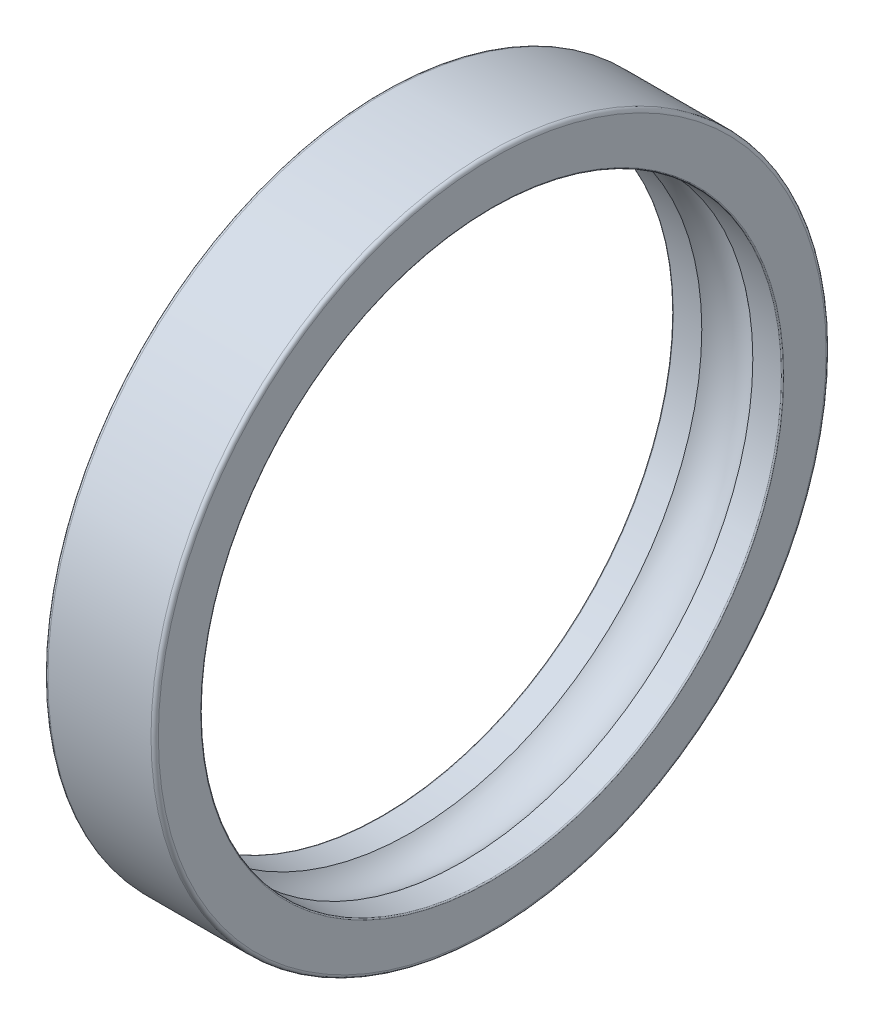
ISO-10303-21;
HEADER;
FILE_DESCRIPTION(('STEP AP214'),'2;1');
FILE_NAME('part.step','',(''),(''),'','','');
FILE_SCHEMA(('AUTOMOTIVE_DESIGN { 1 0 10303 214 1 1 1 1 }'));
ENDSEC;
DATA;
#1=APPLICATION_CONTEXT('core data for automotive mechanical design processes');
#2=APPLICATION_PROTOCOL_DEFINITION('international standard','automotive_design',2000,#1);
#3=PRODUCT_CONTEXT('',#1,'mechanical');
#4=PRODUCT('Part','Part','',(#3));
#5=PRODUCT_RELATED_PRODUCT_CATEGORY('part','',(#4));
#6=PRODUCT_DEFINITION_FORMATION('','',#4);
#7=PRODUCT_DEFINITION_CONTEXT('part definition',#1,'design');
#8=PRODUCT_DEFINITION('design','',#6,#7);
#9=PRODUCT_DEFINITION_SHAPE('','',#8);
#10=(LENGTH_UNIT() NAMED_UNIT(*) SI_UNIT(.MILLI.,.METRE.));
#11=(NAMED_UNIT(*) PLANE_ANGLE_UNIT() SI_UNIT($,.RADIAN.));
#12=(NAMED_UNIT(*) SI_UNIT($,.STERADIAN.) SOLID_ANGLE_UNIT());
#13=UNCERTAINTY_MEASURE_WITH_UNIT(LENGTH_MEASURE(1.E-05),#10,'distance_accuracy_value','');
#14=(GEOMETRIC_REPRESENTATION_CONTEXT(3) GLOBAL_UNCERTAINTY_ASSIGNED_CONTEXT((#13)) GLOBAL_UNIT_ASSIGNED_CONTEXT((#10,
#11,#12)) REPRESENTATION_CONTEXT('',''));
#15=CARTESIAN_POINT('',(0.,0.,0.));
#16=DIRECTION('',(0.,0.,1.));
#17=DIRECTION('',(1.,0.,0.));
#18=AXIS2_PLACEMENT_3D('',#15,#16,#17);
#19=CARTESIAN_POINT('',(0.,-27.7052765498038,-27.2));
#20=DIRECTION('',(-1.,0.,0.));
#21=DIRECTION('',(0.,0.,1.));
#22=AXIS2_PLACEMENT_3D('',#19,#20,#21);
#23=PLANE('',#22);
#24=CARTESIAN_POINT('',(0.,0.,0.));
#25=DIRECTION('',(-1.,0.,0.));
#26=DIRECTION('',(0.,0.,-1.));
#27=AXIS2_PLACEMENT_3D('',#24,#25,#26);
#28=CIRCLE('',#27,27.2);
#29=CARTESIAN_POINT('',(0.,0.,-27.2));
#30=VERTEX_POINT('',#29);
#31=EDGE_CURVE('E50',#30,#30,#28,.F.);
#32=ORIENTED_EDGE('',*,*,#31,.F.);
#33=EDGE_LOOP('',(#32));
#34=FACE_BOUND('',#33,.T.);
#35=CARTESIAN_POINT('',(0.,0.,0.));
#36=DIRECTION('',(1.,0.,0.));
#37=DIRECTION('',(0.,-1.16843726740818E-09,1.));
#38=AXIS2_PLACEMENT_3D('',#35,#36,#37);
#39=CIRCLE('',#38,23.7499999999994);
#40=CARTESIAN_POINT('',(0.,-2.77503851009435E-08,23.7499999999994));
#41=VERTEX_POINT('',#40);
#42=EDGE_CURVE('E47',#41,#41,#39,.T.);
#43=ORIENTED_EDGE('',*,*,#42,.T.);
#44=EDGE_LOOP('',(#43));
#45=FACE_BOUND('',#44,.T.);
#46=ADVANCED_FACE('F15',(#34,#45),#23,.T.);
#47=CARTESIAN_POINT('',(9.,-27.7052765498038,27.2));
#48=DIRECTION('',(1.,0.,0.));
#49=DIRECTION('',(0.,0.,-1.));
#50=AXIS2_PLACEMENT_3D('',#47,#48,#49);
#51=PLANE('',#50);
#52=CARTESIAN_POINT('',(9.,0.,0.));
#53=DIRECTION('',(1.,0.,0.));
#54=DIRECTION('',(0.,0.,1.));
#55=AXIS2_PLACEMENT_3D('',#52,#53,#54);
#56=CIRCLE('',#55,27.2000000077429);
#57=CARTESIAN_POINT('',(9.,0.,27.2000000077429));
#58=VERTEX_POINT('',#57);
#59=EDGE_CURVE('E44',#58,#58,#56,.T.);
#60=ORIENTED_EDGE('',*,*,#59,.T.);
#61=EDGE_LOOP('',(#60));
#62=FACE_BOUND('',#61,.T.);
#63=CARTESIAN_POINT('',(9.,0.,0.));
#64=DIRECTION('',(-1.,0.,0.));
#65=DIRECTION('',(0.,0.,-1.));
#66=AXIS2_PLACEMENT_3D('',#63,#64,#65);
#67=CIRCLE('',#66,23.7500000165255);
#68=CARTESIAN_POINT('',(9.,0.,-23.7500000165255));
#69=VERTEX_POINT('',#68);
#70=EDGE_CURVE('E41',#69,#69,#67,.F.);
#71=ORIENTED_EDGE('',*,*,#70,.F.);
#72=EDGE_LOOP('',(#71));
#73=FACE_BOUND('',#72,.T.);
#74=ADVANCED_FACE('F59',(#62,#73),#51,.T.);
#75=CARTESIAN_POINT('',(0.299999999999941,0.,0.));
#76=DIRECTION('',(1.,0.,0.));
#77=DIRECTION('',(0.,1.92339600142841E-10,1.));
#78=AXIS2_PLACEMENT_3D('',#75,#76,#77);
#79=TOROIDAL_SURFACE('',#78,27.2,0.299999999999939);
#80=ORIENTED_EDGE('',*,*,#31,.T.);
#81=EDGE_LOOP('',(#80));
#82=FACE_BOUND('',#81,.T.);
#83=CARTESIAN_POINT('',(0.299999999999941,0.,0.));
#84=DIRECTION('',(-1.,0.,0.));
#85=DIRECTION('',(0.,0.,-1.));
#86=AXIS2_PLACEMENT_3D('',#83,#84,#85);
#87=CIRCLE('',#86,27.4999999999999);
#88=CARTESIAN_POINT('',(0.299999999999941,0.,-27.4999999999999));
#89=VERTEX_POINT('',#88);
#90=EDGE_CURVE('E38',#89,#89,#87,.F.);
#91=ORIENTED_EDGE('',*,*,#90,.F.);
#92=EDGE_LOOP('',(#91));
#93=FACE_BOUND('',#92,.T.);
#94=ADVANCED_FACE('F54',(#82,#93),#79,.T.);
#95=CARTESIAN_POINT('',(0.0999999999994148,0.,0.));
#96=DIRECTION('',(1.,0.,0.));
#97=DIRECTION('',(0.,0.,1.));
#98=AXIS2_PLACEMENT_3D('',#95,#96,#97);
#99=TOROIDAL_SURFACE('',#98,23.7499999999994,0.0999999999994148);
#100=CARTESIAN_POINT('',(0.100000000000003,0.,0.));
#101=DIRECTION('',(1.,0.,0.));
#102=DIRECTION('',(0.,0.,1.));
#103=AXIS2_PLACEMENT_3D('',#100,#101,#102);
#104=CIRCLE('',#103,23.65);
#105=CARTESIAN_POINT('',(0.100000000000003,0.,23.65));
#106=VERTEX_POINT('',#105);
#107=EDGE_CURVE('E35',#106,#106,#104,.T.);
#108=ORIENTED_EDGE('',*,*,#107,.T.);
#109=EDGE_LOOP('',(#108));
#110=FACE_BOUND('',#109,.T.);
#111=ORIENTED_EDGE('',*,*,#42,.F.);
#112=EDGE_LOOP('',(#111));
#113=FACE_BOUND('',#112,.T.);
#114=ADVANCED_FACE('F63',(#110,#113),#99,.T.);
#115=CARTESIAN_POINT('',(50.,0.,0.));
#116=DIRECTION('',(1.,0.,0.));
#117=DIRECTION('',(0.,0.,1.));
#118=AXIS2_PLACEMENT_3D('',#115,#116,#117);
#119=CYLINDRICAL_SURFACE('',#118,23.65);
#120=CARTESIAN_POINT('',(2.42138868472239,0.,0.));
#121=DIRECTION('',(1.,0.,0.));
#122=DIRECTION('',(0.,0.,1.));
#123=AXIS2_PLACEMENT_3D('',#120,#121,#122);
#124=CIRCLE('',#123,23.65);
#125=CARTESIAN_POINT('',(2.42138868472239,0.,23.65));
#126=VERTEX_POINT('',#125);
#127=EDGE_CURVE('E30',#126,#126,#124,.T.);
#128=ORIENTED_EDGE('',*,*,#127,.T.);
#129=EDGE_LOOP('',(#128));
#130=FACE_BOUND('',#129,.T.);
#131=ORIENTED_EDGE('',*,*,#107,.F.);
#132=EDGE_LOOP('',(#131));
#133=FACE_BOUND('',#132,.T.);
#134=ADVANCED_FACE('F65',(#130,#133),#119,.F.);
#135=CARTESIAN_POINT('',(4.5,0.,0.));
#136=DIRECTION('',(1.,0.,0.));
#137=DIRECTION('',(0.,0.,1.));
#138=AXIS2_PLACEMENT_3D('',#135,#136,#137);
#139=TOROIDAL_SURFACE('',#138,21.25,3.17500000000003);
#140=ORIENTED_EDGE('',*,*,#127,.F.);
#141=EDGE_LOOP('',(#140));
#142=FACE_BOUND('',#141,.T.);
#143=CARTESIAN_POINT('',(6.57861131527761,0.,0.));
#144=DIRECTION('',(1.,0.,0.));
#145=DIRECTION('',(0.,0.,1.));
#146=AXIS2_PLACEMENT_3D('',#143,#144,#145);
#147=CIRCLE('',#146,23.65);
#148=CARTESIAN_POINT('',(6.57861131527761,0.,23.65));
#149=VERTEX_POINT('',#148);
#150=EDGE_CURVE('E26',#149,#149,#147,.T.);
#151=ORIENTED_EDGE('',*,*,#150,.T.);
#152=EDGE_LOOP('',(#151));
#153=FACE_BOUND('',#152,.T.);
#154=ADVANCED_FACE('F73',(#142,#153),#139,.F.);
#155=CARTESIAN_POINT('',(50.,0.,0.));
#156=DIRECTION('',(1.,0.,0.));
#157=DIRECTION('',(0.,0.,1.));
#158=AXIS2_PLACEMENT_3D('',#155,#156,#157);
#159=CYLINDRICAL_SURFACE('',#158,23.65);
#160=CARTESIAN_POINT('',(8.9,0.,0.));
#161=DIRECTION('',(1.,0.,0.));
#162=DIRECTION('',(0.,0.,1.));
#163=AXIS2_PLACEMENT_3D('',#160,#161,#162);
#164=CIRCLE('',#163,23.65);
#165=CARTESIAN_POINT('',(8.9,0.,23.65));
#166=VERTEX_POINT('',#165);
#167=EDGE_CURVE('E22',#166,#166,#164,.T.);
#168=ORIENTED_EDGE('',*,*,#167,.T.);
#169=EDGE_LOOP('',(#168));
#170=FACE_BOUND('',#169,.T.);
#171=ORIENTED_EDGE('',*,*,#150,.F.);
#172=EDGE_LOOP('',(#171));
#173=FACE_BOUND('',#172,.T.);
#174=ADVANCED_FACE('F81',(#170,#173),#159,.F.);
#175=CARTESIAN_POINT('',(8.90000000000066,0.,0.));
#176=DIRECTION('',(1.,0.,0.));
#177=DIRECTION('',(0.,0.,1.));
#178=AXIS2_PLACEMENT_3D('',#175,#176,#177);
#179=TOROIDAL_SURFACE('',#178,23.7499999999993,0.0999999999993402);
#180=ORIENTED_EDGE('',*,*,#70,.T.);
#181=EDGE_LOOP('',(#180));
#182=FACE_BOUND('',#181,.T.);
#183=ORIENTED_EDGE('',*,*,#167,.F.);
#184=EDGE_LOOP('',(#183));
#185=FACE_BOUND('',#184,.T.);
#186=ADVANCED_FACE('F85',(#182,#185),#179,.T.);
#187=CARTESIAN_POINT('',(8.70000000000012,0.,0.));
#188=DIRECTION('',(1.,0.,0.));
#189=DIRECTION('',(0.,0.,1.));
#190=AXIS2_PLACEMENT_3D('',#187,#188,#189);
#191=TOROIDAL_SURFACE('',#190,27.2,0.29999999999988);
#192=CARTESIAN_POINT('',(8.70000000000012,0.,0.));
#193=DIRECTION('',(1.,0.,0.));
#194=DIRECTION('',(0.,0.,1.));
#195=AXIS2_PLACEMENT_3D('',#192,#193,#194);
#196=CIRCLE('',#195,27.4999999999999);
#197=CARTESIAN_POINT('',(8.70000000000012,0.,27.4999999999999));
#198=VERTEX_POINT('',#197);
#199=EDGE_CURVE('E10',#198,#198,#196,.T.);
#200=ORIENTED_EDGE('',*,*,#199,.T.);
#201=EDGE_LOOP('',(#200));
#202=FACE_BOUND('',#201,.T.);
#203=ORIENTED_EDGE('',*,*,#59,.F.);
#204=EDGE_LOOP('',(#203));
#205=FACE_BOUND('',#204,.T.);
#206=ADVANCED_FACE('F87',(#202,#205),#191,.T.);
#207=CARTESIAN_POINT('',(50.,0.,0.));
#208=DIRECTION('',(1.,0.,0.));
#209=DIRECTION('',(0.,1.92339600142841E-10,1.));
#210=AXIS2_PLACEMENT_3D('',#207,#208,#209);
#211=CYLINDRICAL_SURFACE('',#210,27.5);
#212=ORIENTED_EDGE('',*,*,#90,.T.);
#213=EDGE_LOOP('',(#212));
#214=FACE_BOUND('',#213,.T.);
#215=ORIENTED_EDGE('',*,*,#199,.F.);
#216=EDGE_LOOP('',(#215));
#217=FACE_BOUND('',#216,.T.);
#218=ADVANCED_FACE('F17',(#214,#217),#211,.T.);
#219=CLOSED_SHELL('',(#46,#74,#94,#114,#134,#154,#174,#186,#206,#218));
#220=MANIFOLD_SOLID_BREP('B1',#219);
#221=ADVANCED_BREP_SHAPE_REPRESENTATION('',(#18,#220),#14);
#222=SHAPE_DEFINITION_REPRESENTATION(#9,#221);
ENDSEC;
END-ISO-10303-21;
